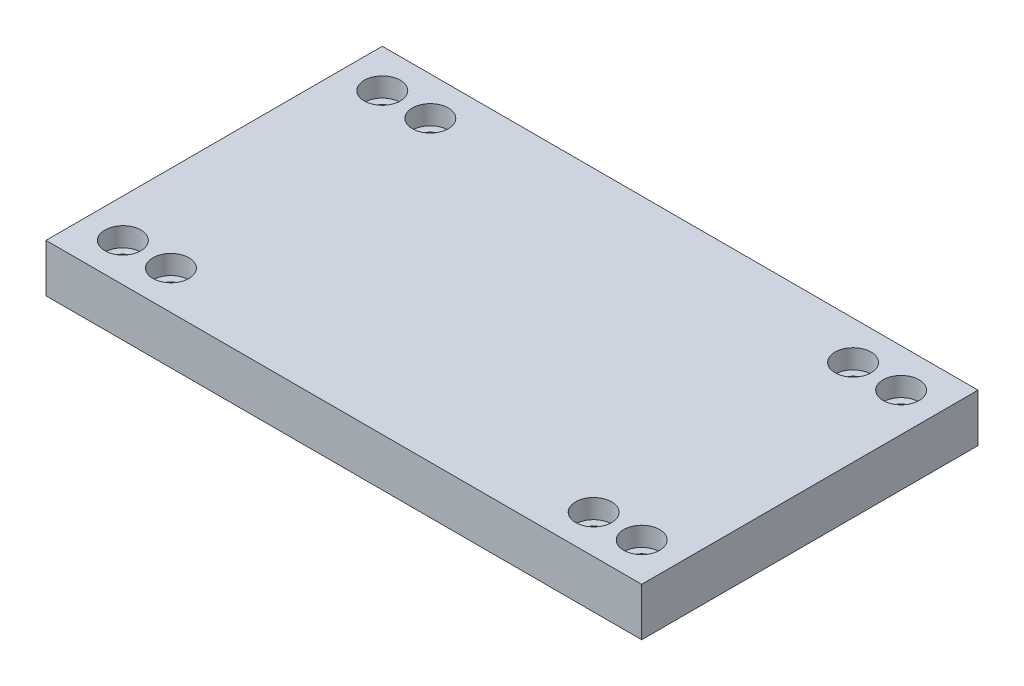
ISO-10303-21;
HEADER;
FILE_DESCRIPTION(('STEP AP214'),'2;1');
FILE_NAME('part.step','',(''),(''),'','','');
FILE_SCHEMA(('AUTOMOTIVE_DESIGN { 1 0 10303 214 1 1 1 1 }'));
ENDSEC;
DATA;
#1=APPLICATION_CONTEXT('core data for automotive mechanical design processes');
#2=APPLICATION_PROTOCOL_DEFINITION('international standard','automotive_design',2000,#1);
#3=PRODUCT_CONTEXT('',#1,'mechanical');
#4=PRODUCT('Part','Part','',(#3));
#5=PRODUCT_RELATED_PRODUCT_CATEGORY('part','',(#4));
#6=PRODUCT_DEFINITION_FORMATION('','',#4);
#7=PRODUCT_DEFINITION_CONTEXT('part definition',#1,'design');
#8=PRODUCT_DEFINITION('design','',#6,#7);
#9=PRODUCT_DEFINITION_SHAPE('','',#8);
#10=(LENGTH_UNIT() NAMED_UNIT(*) SI_UNIT(.MILLI.,.METRE.));
#11=(NAMED_UNIT(*) PLANE_ANGLE_UNIT() SI_UNIT($,.RADIAN.));
#12=(NAMED_UNIT(*) SI_UNIT($,.STERADIAN.) SOLID_ANGLE_UNIT());
#13=UNCERTAINTY_MEASURE_WITH_UNIT(LENGTH_MEASURE(1.E-05),#10,'distance_accuracy_value','');
#14=(GEOMETRIC_REPRESENTATION_CONTEXT(3) GLOBAL_UNCERTAINTY_ASSIGNED_CONTEXT((#13)) GLOBAL_UNIT_ASSIGNED_CONTEXT((#10,
#11,#12)) REPRESENTATION_CONTEXT('',''));
#15=CARTESIAN_POINT('',(0.,0.,0.));
#16=DIRECTION('',(0.,0.,1.));
#17=DIRECTION('',(1.,0.,0.));
#18=AXIS2_PLACEMENT_3D('',#15,#16,#17);
#19=CARTESIAN_POINT('',(-50.7368421052632,0.,-18.7327935222672));
#20=DIRECTION('',(0.,1.,0.));
#21=DIRECTION('',(0.,0.,1.));
#22=AXIS2_PLACEMENT_3D('',#19,#20,#21);
#23=CYLINDRICAL_SURFACE('',#22,2.15);
#24=CARTESIAN_POINT('',(-50.7368421052632,0.,-18.7327935222672));
#25=DIRECTION('',(0.,1.,0.));
#26=DIRECTION('',(0.,0.,1.));
#27=AXIS2_PLACEMENT_3D('',#24,#25,#26);
#28=CIRCLE('',#27,2.15);
#29=CARTESIAN_POINT('',(-50.7368421052632,0.,-16.5827935222672));
#30=VERTEX_POINT('',#29);
#31=EDGE_CURVE('E118',#30,#30,#28,.T.);
#32=ORIENTED_EDGE('',*,*,#31,.F.);
#33=EDGE_LOOP('',(#32));
#34=FACE_BOUND('',#33,.T.);
#35=CARTESIAN_POINT('',(-50.7368421052632,6.,-18.7327935222672));
#36=DIRECTION('',(0.,1.,0.));
#37=DIRECTION('',(0.,0.,1.));
#38=AXIS2_PLACEMENT_3D('',#35,#36,#37);
#39=CIRCLE('',#38,2.15);
#40=CARTESIAN_POINT('',(-50.7368421052632,6.,-16.5827935222672));
#41=VERTEX_POINT('',#40);
#42=EDGE_CURVE('E47',#41,#41,#39,.F.);
#43=ORIENTED_EDGE('',*,*,#42,.F.);
#44=EDGE_LOOP('',(#43));
#45=FACE_BOUND('',#44,.T.);
#46=ADVANCED_FACE('F43',(#34,#45),#23,.F.);
#47=CARTESIAN_POINT('',(57.2631578947368,0.,-18.7327935222672));
#48=DIRECTION('',(0.,1.,0.));
#49=DIRECTION('',(0.,0.,1.));
#50=AXIS2_PLACEMENT_3D('',#47,#48,#49);
#51=CYLINDRICAL_SURFACE('',#50,2.15);
#52=CARTESIAN_POINT('',(57.2631578947368,0.,-18.7327935222672));
#53=DIRECTION('',(0.,1.,0.));
#54=DIRECTION('',(0.,0.,1.));
#55=AXIS2_PLACEMENT_3D('',#52,#53,#54);
#56=CIRCLE('',#55,2.15);
#57=CARTESIAN_POINT('',(57.2631578947368,0.,-16.5827935222672));
#58=VERTEX_POINT('',#57);
#59=EDGE_CURVE('E174',#58,#58,#56,.T.);
#60=ORIENTED_EDGE('',*,*,#59,.F.);
#61=EDGE_LOOP('',(#60));
#62=FACE_BOUND('',#61,.T.);
#63=CARTESIAN_POINT('',(57.2631578947368,6.,-18.7327935222672));
#64=DIRECTION('',(0.,1.,0.));
#65=DIRECTION('',(0.,0.,1.));
#66=AXIS2_PLACEMENT_3D('',#63,#64,#65);
#67=CIRCLE('',#66,2.15);
#68=CARTESIAN_POINT('',(57.2631578947368,6.,-16.5827935222672));
#69=VERTEX_POINT('',#68);
#70=EDGE_CURVE('E156',#69,#69,#67,.F.);
#71=ORIENTED_EDGE('',*,*,#70,.F.);
#72=EDGE_LOOP('',(#71));
#73=FACE_BOUND('',#72,.T.);
#74=ADVANCED_FACE('F209',(#62,#73),#51,.F.);
#75=CARTESIAN_POINT('',(47.2631578947368,0.,35.2672064777328));
#76=DIRECTION('',(0.,1.,0.));
#77=DIRECTION('',(0.,0.,1.));
#78=AXIS2_PLACEMENT_3D('',#75,#76,#77);
#79=CYLINDRICAL_SURFACE('',#78,2.15);
#80=CARTESIAN_POINT('',(47.2631578947368,0.,35.2672064777328));
#81=DIRECTION('',(0.,1.,0.));
#82=DIRECTION('',(0.,0.,1.));
#83=AXIS2_PLACEMENT_3D('',#80,#81,#82);
#84=CIRCLE('',#83,2.15);
#85=CARTESIAN_POINT('',(47.2631578947368,0.,37.4172064777328));
#86=VERTEX_POINT('',#85);
#87=EDGE_CURVE('E168',#86,#86,#84,.T.);
#88=ORIENTED_EDGE('',*,*,#87,.F.);
#89=EDGE_LOOP('',(#88));
#90=FACE_BOUND('',#89,.T.);
#91=CARTESIAN_POINT('',(47.2631578947368,6.,35.2672064777328));
#92=DIRECTION('',(0.,1.,0.));
#93=DIRECTION('',(0.,0.,1.));
#94=AXIS2_PLACEMENT_3D('',#91,#92,#93);
#95=CIRCLE('',#94,2.15);
#96=CARTESIAN_POINT('',(47.2631578947368,6.,37.4172064777328));
#97=VERTEX_POINT('',#96);
#98=EDGE_CURVE('E153',#97,#97,#95,.F.);
#99=ORIENTED_EDGE('',*,*,#98,.F.);
#100=EDGE_LOOP('',(#99));
#101=FACE_BOUND('',#100,.T.);
#102=ADVANCED_FACE('F214',(#90,#101),#79,.F.);
#103=CARTESIAN_POINT('',(57.2631578947368,0.,35.2672064777328));
#104=DIRECTION('',(0.,1.,0.));
#105=DIRECTION('',(0.,0.,1.));
#106=AXIS2_PLACEMENT_3D('',#103,#104,#105);
#107=CYLINDRICAL_SURFACE('',#106,2.15);
#108=CARTESIAN_POINT('',(57.2631578947368,0.,35.2672064777328));
#109=DIRECTION('',(0.,1.,0.));
#110=DIRECTION('',(0.,0.,1.));
#111=AXIS2_PLACEMENT_3D('',#108,#109,#110);
#112=CIRCLE('',#111,2.15);
#113=CARTESIAN_POINT('',(57.2631578947368,0.,37.4172064777328));
#114=VERTEX_POINT('',#113);
#115=EDGE_CURVE('E163',#114,#114,#112,.T.);
#116=ORIENTED_EDGE('',*,*,#115,.F.);
#117=EDGE_LOOP('',(#116));
#118=FACE_BOUND('',#117,.T.);
#119=CARTESIAN_POINT('',(57.2631578947368,6.,35.2672064777328));
#120=DIRECTION('',(0.,1.,0.));
#121=DIRECTION('',(0.,0.,1.));
#122=AXIS2_PLACEMENT_3D('',#119,#120,#121);
#123=CIRCLE('',#122,2.15);
#124=CARTESIAN_POINT('',(57.2631578947368,6.,37.4172064777328));
#125=VERTEX_POINT('',#124);
#126=EDGE_CURVE('E149',#125,#125,#123,.F.);
#127=ORIENTED_EDGE('',*,*,#126,.F.);
#128=EDGE_LOOP('',(#127));
#129=FACE_BOUND('',#128,.T.);
#130=ADVANCED_FACE('F253',(#118,#129),#107,.F.);
#131=CARTESIAN_POINT('',(-40.7368421052632,0.,-18.7327935222672));
#132=DIRECTION('',(0.,1.,0.));
#133=DIRECTION('',(0.,0.,1.));
#134=AXIS2_PLACEMENT_3D('',#131,#132,#133);
#135=CYLINDRICAL_SURFACE('',#134,2.15);
#136=CARTESIAN_POINT('',(-40.7368421052632,0.,-18.7327935222672));
#137=DIRECTION('',(0.,1.,0.));
#138=DIRECTION('',(0.,0.,1.));
#139=AXIS2_PLACEMENT_3D('',#136,#137,#138);
#140=CIRCLE('',#139,2.15);
#141=CARTESIAN_POINT('',(-40.7368421052632,0.,-16.5827935222672));
#142=VERTEX_POINT('',#141);
#143=EDGE_CURVE('E192',#142,#142,#140,.T.);
#144=ORIENTED_EDGE('',*,*,#143,.F.);
#145=EDGE_LOOP('',(#144));
#146=FACE_BOUND('',#145,.T.);
#147=CARTESIAN_POINT('',(-40.7368421052632,6.,-18.7327935222672));
#148=DIRECTION('',(0.,1.,0.));
#149=DIRECTION('',(0.,0.,1.));
#150=AXIS2_PLACEMENT_3D('',#147,#148,#149);
#151=CIRCLE('',#150,2.15);
#152=CARTESIAN_POINT('',(-40.7368421052632,6.,-16.5827935222672));
#153=VERTEX_POINT('',#152);
#154=EDGE_CURVE('E145',#153,#153,#151,.F.);
#155=ORIENTED_EDGE('',*,*,#154,.F.);
#156=EDGE_LOOP('',(#155));
#157=FACE_BOUND('',#156,.T.);
#158=ADVANCED_FACE('F251',(#146,#157),#135,.F.);
#159=CARTESIAN_POINT('',(-50.7368421052632,0.,35.2672064777328));
#160=DIRECTION('',(0.,1.,0.));
#161=DIRECTION('',(0.,0.,1.));
#162=AXIS2_PLACEMENT_3D('',#159,#160,#161);
#163=CYLINDRICAL_SURFACE('',#162,2.15);
#164=CARTESIAN_POINT('',(-50.7368421052632,0.,35.2672064777328));
#165=DIRECTION('',(0.,1.,0.));
#166=DIRECTION('',(0.,0.,1.));
#167=AXIS2_PLACEMENT_3D('',#164,#165,#166);
#168=CIRCLE('',#167,2.15);
#169=CARTESIAN_POINT('',(-50.7368421052632,0.,37.4172064777328));
#170=VERTEX_POINT('',#169);
#171=EDGE_CURVE('E188',#170,#170,#168,.T.);
#172=ORIENTED_EDGE('',*,*,#171,.F.);
#173=EDGE_LOOP('',(#172));
#174=FACE_BOUND('',#173,.T.);
#175=CARTESIAN_POINT('',(-50.7368421052632,6.,35.2672064777328));
#176=DIRECTION('',(0.,1.,0.));
#177=DIRECTION('',(0.,0.,1.));
#178=AXIS2_PLACEMENT_3D('',#175,#176,#177);
#179=CIRCLE('',#178,2.15);
#180=CARTESIAN_POINT('',(-50.7368421052632,6.,37.4172064777328));
#181=VERTEX_POINT('',#180);
#182=EDGE_CURVE('E141',#181,#181,#179,.F.);
#183=ORIENTED_EDGE('',*,*,#182,.F.);
#184=EDGE_LOOP('',(#183));
#185=FACE_BOUND('',#184,.T.);
#186=ADVANCED_FACE('F219',(#174,#185),#163,.F.);
#187=CARTESIAN_POINT('',(-40.7368421052632,0.,35.2672064777328));
#188=DIRECTION('',(0.,1.,0.));
#189=DIRECTION('',(0.,0.,1.));
#190=AXIS2_PLACEMENT_3D('',#187,#188,#189);
#191=CYLINDRICAL_SURFACE('',#190,2.15);
#192=CARTESIAN_POINT('',(-40.7368421052632,0.,35.2672064777328));
#193=DIRECTION('',(0.,1.,0.));
#194=DIRECTION('',(0.,0.,1.));
#195=AXIS2_PLACEMENT_3D('',#192,#193,#194);
#196=CIRCLE('',#195,2.15);
#197=CARTESIAN_POINT('',(-40.7368421052632,0.,37.4172064777328));
#198=VERTEX_POINT('',#197);
#199=EDGE_CURVE('E184',#198,#198,#196,.T.);
#200=ORIENTED_EDGE('',*,*,#199,.F.);
#201=EDGE_LOOP('',(#200));
#202=FACE_BOUND('',#201,.T.);
#203=CARTESIAN_POINT('',(-40.7368421052632,6.,35.2672064777328));
#204=DIRECTION('',(0.,1.,0.));
#205=DIRECTION('',(0.,0.,1.));
#206=AXIS2_PLACEMENT_3D('',#203,#204,#205);
#207=CIRCLE('',#206,2.15);
#208=CARTESIAN_POINT('',(-40.7368421052632,6.,37.4172064777328));
#209=VERTEX_POINT('',#208);
#210=EDGE_CURVE('E136',#209,#209,#207,.F.);
#211=ORIENTED_EDGE('',*,*,#210,.F.);
#212=EDGE_LOOP('',(#211));
#213=FACE_BOUND('',#212,.T.);
#214=ADVANCED_FACE('F240',(#202,#213),#191,.F.);
#215=CARTESIAN_POINT('',(47.2631578947368,0.,-18.7327935222672));
#216=DIRECTION('',(0.,1.,0.));
#217=DIRECTION('',(0.,0.,1.));
#218=AXIS2_PLACEMENT_3D('',#215,#216,#217);
#219=CYLINDRICAL_SURFACE('',#218,2.15);
#220=CARTESIAN_POINT('',(47.2631578947368,0.,-18.7327935222672));
#221=DIRECTION('',(0.,1.,0.));
#222=DIRECTION('',(0.,0.,1.));
#223=AXIS2_PLACEMENT_3D('',#220,#221,#222);
#224=CIRCLE('',#223,2.15);
#225=CARTESIAN_POINT('',(47.2631578947368,0.,-16.5827935222672));
#226=VERTEX_POINT('',#225);
#227=EDGE_CURVE('E182',#226,#226,#224,.T.);
#228=ORIENTED_EDGE('',*,*,#227,.F.);
#229=EDGE_LOOP('',(#228));
#230=FACE_BOUND('',#229,.T.);
#231=CARTESIAN_POINT('',(47.2631578947368,6.,-18.7327935222672));
#232=DIRECTION('',(0.,1.,0.));
#233=DIRECTION('',(0.,0.,1.));
#234=AXIS2_PLACEMENT_3D('',#231,#232,#233);
#235=CIRCLE('',#234,2.15);
#236=CARTESIAN_POINT('',(47.2631578947368,6.,-16.5827935222672));
#237=VERTEX_POINT('',#236);
#238=EDGE_CURVE('E132',#237,#237,#235,.F.);
#239=ORIENTED_EDGE('',*,*,#238,.F.);
#240=EDGE_LOOP('',(#239));
#241=FACE_BOUND('',#240,.T.);
#242=ADVANCED_FACE('F236',(#230,#241),#219,.F.);
#243=CARTESIAN_POINT('',(-58.7368421052632,10.,-26.7327935222672));
#244=DIRECTION('',(1.,0.,0.));
#245=DIRECTION('',(0.,0.,-1.));
#246=AXIS2_PLACEMENT_3D('',#243,#244,#245);
#247=PLANE('',#246);
#248=DIRECTION('',(0.,0.,1.));
#249=VECTOR('',#248,1.);
#250=CARTESIAN_POINT('',(-58.7368421052632,0.,-26.7327935222672));
#251=LINE('',#250,#249);
#252=CARTESIAN_POINT('',(-58.7368421052632,0.,-26.7327935222672));
#253=VERTEX_POINT('',#252);
#254=CARTESIAN_POINT('',(-58.7368421052631,0.,43.2672064777328));
#255=VERTEX_POINT('',#254);
#256=EDGE_CURVE('E115',#253,#255,#251,.T.);
#257=ORIENTED_EDGE('',*,*,#256,.T.);
#258=DIRECTION('',(0.,-1.,0.));
#259=VECTOR('',#258,1.);
#260=CARTESIAN_POINT('',(-58.7368421052631,10.,43.2672064777328));
#261=LINE('',#260,#259);
#262=CARTESIAN_POINT('',(-58.7368421052631,10.,43.2672064777328));
#263=VERTEX_POINT('',#262);
#264=EDGE_CURVE('E11',#263,#255,#261,.T.);
#265=ORIENTED_EDGE('',*,*,#264,.F.);
#266=DIRECTION('',(0.,0.,1.));
#267=VECTOR('',#266,1.);
#268=CARTESIAN_POINT('',(-58.7368421052632,10.,-26.7327935222672));
#269=LINE('',#268,#267);
#270=CARTESIAN_POINT('',(-58.7368421052632,10.,-26.7327935222672));
#271=VERTEX_POINT('',#270);
#272=EDGE_CURVE('E96',#271,#263,#269,.T.);
#273=ORIENTED_EDGE('',*,*,#272,.F.);
#274=DIRECTION('',(0.,-1.,0.));
#275=VECTOR('',#274,1.);
#276=CARTESIAN_POINT('',(-58.7368421052632,10.,-26.7327935222672));
#277=LINE('',#276,#275);
#278=EDGE_CURVE('E63',#271,#253,#277,.T.);
#279=ORIENTED_EDGE('',*,*,#278,.T.);
#280=EDGE_LOOP('',(#257,#265,#273,#279));
#281=FACE_BOUND('',#280,.T.);
#282=ADVANCED_FACE('F45',(#281),#247,.F.);
#283=CARTESIAN_POINT('',(-58.7368421052631,10.,43.2672064777328));
#284=DIRECTION('',(0.,0.,-1.));
#285=DIRECTION('',(-1.,0.,0.));
#286=AXIS2_PLACEMENT_3D('',#283,#284,#285);
#287=PLANE('',#286);
#288=DIRECTION('',(1.,0.,0.));
#289=VECTOR('',#288,1.);
#290=CARTESIAN_POINT('',(-58.7368421052631,0.,43.2672064777328));
#291=LINE('',#290,#289);
#292=CARTESIAN_POINT('',(65.2631578947368,0.,43.2672064777328));
#293=VERTEX_POINT('',#292);
#294=EDGE_CURVE('E102',#255,#293,#291,.T.);
#295=ORIENTED_EDGE('',*,*,#294,.T.);
#296=DIRECTION('',(0.,-1.,0.));
#297=VECTOR('',#296,1.);
#298=CARTESIAN_POINT('',(65.2631578947368,10.,43.2672064777328));
#299=LINE('',#298,#297);
#300=CARTESIAN_POINT('',(65.2631578947368,10.,43.2672064777328));
#301=VERTEX_POINT('',#300);
#302=EDGE_CURVE('E54',#301,#293,#299,.T.);
#303=ORIENTED_EDGE('',*,*,#302,.F.);
#304=DIRECTION('',(1.,0.,0.));
#305=VECTOR('',#304,1.);
#306=CARTESIAN_POINT('',(-58.7368421052631,10.,43.2672064777328));
#307=LINE('',#306,#305);
#308=EDGE_CURVE('E88',#263,#301,#307,.T.);
#309=ORIENTED_EDGE('',*,*,#308,.F.);
#310=ORIENTED_EDGE('',*,*,#264,.T.);
#311=EDGE_LOOP('',(#295,#303,#309,#310));
#312=FACE_BOUND('',#311,.T.);
#313=ADVANCED_FACE('F101',(#312),#287,.F.);
#314=CARTESIAN_POINT('',(65.2631578947368,10.,-26.7327935222672));
#315=DIRECTION('',(1.,0.,0.));
#316=DIRECTION('',(0.,0.,-1.));
#317=AXIS2_PLACEMENT_3D('',#314,#315,#316);
#318=PLANE('',#317);
#319=DIRECTION('',(0.,0.,1.));
#320=VECTOR('',#319,1.);
#321=CARTESIAN_POINT('',(65.2631578947368,0.,-26.7327935222672));
#322=LINE('',#321,#320);
#323=CARTESIAN_POINT('',(65.2631578947368,0.,-26.7327935222672));
#324=VERTEX_POINT('',#323);
#325=EDGE_CURVE('E121',#324,#293,#322,.T.);
#326=ORIENTED_EDGE('',*,*,#325,.F.);
#327=DIRECTION('',(0.,-1.,0.));
#328=VECTOR('',#327,1.);
#329=CARTESIAN_POINT('',(65.2631578947368,10.,-26.7327935222672));
#330=LINE('',#329,#328);
#331=CARTESIAN_POINT('',(65.2631578947368,10.,-26.7327935222672));
#332=VERTEX_POINT('',#331);
#333=EDGE_CURVE('E77',#332,#324,#330,.T.);
#334=ORIENTED_EDGE('',*,*,#333,.F.);
#335=DIRECTION('',(0.,0.,1.));
#336=VECTOR('',#335,1.);
#337=CARTESIAN_POINT('',(65.2631578947368,10.,-26.7327935222672));
#338=LINE('',#337,#336);
#339=EDGE_CURVE('E95',#332,#301,#338,.T.);
#340=ORIENTED_EDGE('',*,*,#339,.T.);
#341=ORIENTED_EDGE('',*,*,#302,.T.);
#342=EDGE_LOOP('',(#326,#334,#340,#341));
#343=FACE_BOUND('',#342,.T.);
#344=ADVANCED_FACE('F107',(#343),#318,.T.);
#345=CARTESIAN_POINT('',(-58.7368421052632,10.,-26.7327935222672));
#346=DIRECTION('',(0.,0.,-1.));
#347=DIRECTION('',(-1.,0.,0.));
#348=AXIS2_PLACEMENT_3D('',#345,#346,#347);
#349=PLANE('',#348);
#350=DIRECTION('',(1.,0.,0.));
#351=VECTOR('',#350,1.);
#352=CARTESIAN_POINT('',(-58.7368421052632,0.,-26.7327935222672));
#353=LINE('',#352,#351);
#354=EDGE_CURVE('E124',#253,#324,#353,.T.);
#355=ORIENTED_EDGE('',*,*,#354,.F.);
#356=ORIENTED_EDGE('',*,*,#278,.F.);
#357=DIRECTION('',(1.,0.,0.));
#358=VECTOR('',#357,1.);
#359=CARTESIAN_POINT('',(-58.7368421052632,10.,-26.7327935222672));
#360=LINE('',#359,#358);
#361=EDGE_CURVE('E109',#271,#332,#360,.T.);
#362=ORIENTED_EDGE('',*,*,#361,.T.);
#363=ORIENTED_EDGE('',*,*,#333,.T.);
#364=EDGE_LOOP('',(#355,#356,#362,#363));
#365=FACE_BOUND('',#364,.T.);
#366=ADVANCED_FACE('F223',(#365),#349,.T.);
#367=CARTESIAN_POINT('',(0.,10.,0.));
#368=DIRECTION('',(0.,1.,0.));
#369=DIRECTION('',(0.,0.,1.));
#370=AXIS2_PLACEMENT_3D('',#367,#368,#369);
#371=PLANE('',#370);
#372=CARTESIAN_POINT('',(-40.7368421052632,10.,-18.7327935222672));
#373=DIRECTION('',(0.,1.,0.));
#374=DIRECTION('',(0.,0.,1.));
#375=AXIS2_PLACEMENT_3D('',#372,#373,#374);
#376=CIRCLE('',#375,3.75000000000001);
#377=CARTESIAN_POINT('',(-40.7368421052632,10.,-14.9827935222672));
#378=VERTEX_POINT('',#377);
#379=EDGE_CURVE('E360',#378,#378,#376,.T.);
#380=ORIENTED_EDGE('',*,*,#379,.F.);
#381=EDGE_LOOP('',(#380));
#382=FACE_BOUND('',#381,.T.);
#383=CARTESIAN_POINT('',(47.2631578947368,10.,-18.7327935222672));
#384=DIRECTION('',(0.,1.,0.));
#385=DIRECTION('',(0.,0.,1.));
#386=AXIS2_PLACEMENT_3D('',#383,#384,#385);
#387=CIRCLE('',#386,3.75000000000001);
#388=CARTESIAN_POINT('',(47.2631578947368,10.,-14.9827935222672));
#389=VERTEX_POINT('',#388);
#390=EDGE_CURVE('E367',#389,#389,#387,.T.);
#391=ORIENTED_EDGE('',*,*,#390,.F.);
#392=EDGE_LOOP('',(#391));
#393=FACE_BOUND('',#392,.T.);
#394=CARTESIAN_POINT('',(57.2631578947368,10.,-18.7327935222672));
#395=DIRECTION('',(0.,1.,0.));
#396=DIRECTION('',(0.,0.,1.));
#397=AXIS2_PLACEMENT_3D('',#394,#395,#396);
#398=CIRCLE('',#397,3.75);
#399=CARTESIAN_POINT('',(57.2631578947368,10.,-14.9827935222672));
#400=VERTEX_POINT('',#399);
#401=EDGE_CURVE('E375',#400,#400,#398,.T.);
#402=ORIENTED_EDGE('',*,*,#401,.F.);
#403=EDGE_LOOP('',(#402));
#404=FACE_BOUND('',#403,.T.);
#405=CARTESIAN_POINT('',(57.2631578947368,10.,35.2672064777328));
#406=DIRECTION('',(0.,1.,0.));
#407=DIRECTION('',(0.,0.,1.));
#408=AXIS2_PLACEMENT_3D('',#405,#406,#407);
#409=CIRCLE('',#408,3.75000000000001);
#410=CARTESIAN_POINT('',(57.2631578947368,10.,39.0172064777328));
#411=VERTEX_POINT('',#410);
#412=EDGE_CURVE('E383',#411,#411,#409,.T.);
#413=ORIENTED_EDGE('',*,*,#412,.F.);
#414=EDGE_LOOP('',(#413));
#415=FACE_BOUND('',#414,.T.);
#416=CARTESIAN_POINT('',(47.2631578947368,10.,35.2672064777328));
#417=DIRECTION('',(0.,1.,0.));
#418=DIRECTION('',(0.,0.,1.));
#419=AXIS2_PLACEMENT_3D('',#416,#417,#418);
#420=CIRCLE('',#419,3.75);
#421=CARTESIAN_POINT('',(47.2631578947368,10.,39.0172064777328));
#422=VERTEX_POINT('',#421);
#423=EDGE_CURVE('E390',#422,#422,#420,.T.);
#424=ORIENTED_EDGE('',*,*,#423,.F.);
#425=EDGE_LOOP('',(#424));
#426=FACE_BOUND('',#425,.T.);
#427=CARTESIAN_POINT('',(-40.7368421052632,10.,35.2672064777328));
#428=DIRECTION('',(0.,1.,0.));
#429=DIRECTION('',(0.,0.,1.));
#430=AXIS2_PLACEMENT_3D('',#427,#428,#429);
#431=CIRCLE('',#430,3.75000000000001);
#432=CARTESIAN_POINT('',(-40.7368421052632,10.,39.0172064777328));
#433=VERTEX_POINT('',#432);
#434=EDGE_CURVE('E405',#433,#433,#431,.T.);
#435=ORIENTED_EDGE('',*,*,#434,.F.);
#436=EDGE_LOOP('',(#435));
#437=FACE_BOUND('',#436,.T.);
#438=CARTESIAN_POINT('',(-50.7368421052632,10.,35.2672064777328));
#439=DIRECTION('',(0.,1.,0.));
#440=DIRECTION('',(0.,0.,1.));
#441=AXIS2_PLACEMENT_3D('',#438,#439,#440);
#442=CIRCLE('',#441,3.75);
#443=CARTESIAN_POINT('',(-50.7368421052632,10.,39.0172064777328));
#444=VERTEX_POINT('',#443);
#445=EDGE_CURVE('E352',#444,#444,#442,.T.);
#446=ORIENTED_EDGE('',*,*,#445,.F.);
#447=EDGE_LOOP('',(#446));
#448=FACE_BOUND('',#447,.T.);
#449=CARTESIAN_POINT('',(-50.7368421052632,10.,-18.7327935222672));
#450=DIRECTION('',(0.,1.,0.));
#451=DIRECTION('',(0.,0.,1.));
#452=AXIS2_PLACEMENT_3D('',#449,#450,#451);
#453=CIRCLE('',#452,3.75);
#454=CARTESIAN_POINT('',(-50.7368421052632,10.,-14.9827935222672));
#455=VERTEX_POINT('',#454);
#456=EDGE_CURVE('E178',#455,#455,#453,.T.);
#457=ORIENTED_EDGE('',*,*,#456,.F.);
#458=EDGE_LOOP('',(#457));
#459=FACE_BOUND('',#458,.T.);
#460=ORIENTED_EDGE('',*,*,#272,.T.);
#461=ORIENTED_EDGE('',*,*,#308,.T.);
#462=ORIENTED_EDGE('',*,*,#339,.F.);
#463=ORIENTED_EDGE('',*,*,#361,.F.);
#464=EDGE_LOOP('',(#460,#461,#462,#463));
#465=FACE_BOUND('',#464,.T.);
#466=ADVANCED_FACE('F92',(#382,#393,#404,#415,#426,#437,#448,#459,#465),#371,.T.);
#467=CARTESIAN_POINT('',(0.,0.,0.));
#468=DIRECTION('',(0.,1.,0.));
#469=DIRECTION('',(0.,0.,1.));
#470=AXIS2_PLACEMENT_3D('',#467,#468,#469);
#471=PLANE('',#470);
#472=ORIENTED_EDGE('',*,*,#227,.T.);
#473=EDGE_LOOP('',(#472));
#474=FACE_BOUND('',#473,.T.);
#475=ORIENTED_EDGE('',*,*,#199,.T.);
#476=EDGE_LOOP('',(#475));
#477=FACE_BOUND('',#476,.T.);
#478=ORIENTED_EDGE('',*,*,#171,.T.);
#479=EDGE_LOOP('',(#478));
#480=FACE_BOUND('',#479,.T.);
#481=ORIENTED_EDGE('',*,*,#143,.T.);
#482=EDGE_LOOP('',(#481));
#483=FACE_BOUND('',#482,.T.);
#484=ORIENTED_EDGE('',*,*,#115,.T.);
#485=EDGE_LOOP('',(#484));
#486=FACE_BOUND('',#485,.T.);
#487=ORIENTED_EDGE('',*,*,#87,.T.);
#488=EDGE_LOOP('',(#487));
#489=FACE_BOUND('',#488,.T.);
#490=ORIENTED_EDGE('',*,*,#59,.T.);
#491=EDGE_LOOP('',(#490));
#492=FACE_BOUND('',#491,.T.);
#493=ORIENTED_EDGE('',*,*,#31,.T.);
#494=EDGE_LOOP('',(#493));
#495=FACE_BOUND('',#494,.T.);
#496=ORIENTED_EDGE('',*,*,#256,.F.);
#497=ORIENTED_EDGE('',*,*,#354,.T.);
#498=ORIENTED_EDGE('',*,*,#325,.T.);
#499=ORIENTED_EDGE('',*,*,#294,.F.);
#500=EDGE_LOOP('',(#496,#497,#498,#499));
#501=FACE_BOUND('',#500,.T.);
#502=ADVANCED_FACE('F204',(#474,#477,#480,#483,#486,#489,#492,#495,#501),#471,.F.);
#503=CARTESIAN_POINT('',(47.2631578947368,6.,-18.7327935222672));
#504=DIRECTION('',(0.,1.,0.));
#505=DIRECTION('',(0.,0.,1.));
#506=AXIS2_PLACEMENT_3D('',#503,#504,#505);
#507=PLANE('',#506);
#508=CARTESIAN_POINT('',(47.2631578947368,6.,-18.7327935222672));
#509=DIRECTION('',(0.,1.,0.));
#510=DIRECTION('',(0.,0.,1.));
#511=AXIS2_PLACEMENT_3D('',#508,#509,#510);
#512=CIRCLE('',#511,3.75000000000001);
#513=CARTESIAN_POINT('',(47.2631578947368,6.,-14.9827935222672));
#514=VERTEX_POINT('',#513);
#515=EDGE_CURVE('E371',#514,#514,#512,.T.);
#516=ORIENTED_EDGE('',*,*,#515,.T.);
#517=EDGE_LOOP('',(#516));
#518=FACE_BOUND('',#517,.T.);
#519=ORIENTED_EDGE('',*,*,#238,.T.);
#520=EDGE_LOOP('',(#519));
#521=FACE_BOUND('',#520,.T.);
#522=ADVANCED_FACE('F227',(#518,#521),#507,.T.);
#523=CARTESIAN_POINT('',(47.2631578947368,6.,-18.7327935222672));
#524=DIRECTION('',(0.,1.,0.));
#525=DIRECTION('',(0.,0.,1.));
#526=AXIS2_PLACEMENT_3D('',#523,#524,#525);
#527=CYLINDRICAL_SURFACE('',#526,3.75000000000001);
#528=ORIENTED_EDGE('',*,*,#515,.F.);
#529=EDGE_LOOP('',(#528));
#530=FACE_BOUND('',#529,.T.);
#531=ORIENTED_EDGE('',*,*,#390,.T.);
#532=EDGE_LOOP('',(#531));
#533=FACE_BOUND('',#532,.T.);
#534=ADVANCED_FACE('F285',(#530,#533),#527,.F.);
#535=CARTESIAN_POINT('',(-40.7368421052632,6.,35.2672064777328));
#536=DIRECTION('',(0.,1.,0.));
#537=DIRECTION('',(0.,0.,1.));
#538=AXIS2_PLACEMENT_3D('',#535,#536,#537);
#539=PLANE('',#538);
#540=CARTESIAN_POINT('',(-40.7368421052632,6.,35.2672064777328));
#541=DIRECTION('',(0.,1.,0.));
#542=DIRECTION('',(0.,0.,1.));
#543=AXIS2_PLACEMENT_3D('',#540,#541,#542);
#544=CIRCLE('',#543,3.75000000000001);
#545=CARTESIAN_POINT('',(-40.7368421052632,6.,39.0172064777328));
#546=VERTEX_POINT('',#545);
#547=EDGE_CURVE('E356',#546,#546,#544,.T.);
#548=ORIENTED_EDGE('',*,*,#547,.T.);
#549=EDGE_LOOP('',(#548));
#550=FACE_BOUND('',#549,.T.);
#551=ORIENTED_EDGE('',*,*,#210,.T.);
#552=EDGE_LOOP('',(#551));
#553=FACE_BOUND('',#552,.T.);
#554=ADVANCED_FACE('F288',(#550,#553),#539,.T.);
#555=CARTESIAN_POINT('',(-40.7368421052632,6.,35.2672064777328));
#556=DIRECTION('',(0.,1.,0.));
#557=DIRECTION('',(0.,0.,1.));
#558=AXIS2_PLACEMENT_3D('',#555,#556,#557);
#559=CYLINDRICAL_SURFACE('',#558,3.75000000000001);
#560=ORIENTED_EDGE('',*,*,#547,.F.);
#561=EDGE_LOOP('',(#560));
#562=FACE_BOUND('',#561,.T.);
#563=ORIENTED_EDGE('',*,*,#434,.T.);
#564=EDGE_LOOP('',(#563));
#565=FACE_BOUND('',#564,.T.);
#566=ADVANCED_FACE('F335',(#562,#565),#559,.F.);
#567=CARTESIAN_POINT('',(-50.7368421052632,6.,35.2672064777328));
#568=DIRECTION('',(0.,1.,0.));
#569=DIRECTION('',(0.,0.,1.));
#570=AXIS2_PLACEMENT_3D('',#567,#568,#569);
#571=PLANE('',#570);
#572=CARTESIAN_POINT('',(-50.7368421052632,6.,35.2672064777328));
#573=DIRECTION('',(0.,1.,0.));
#574=DIRECTION('',(0.,0.,1.));
#575=AXIS2_PLACEMENT_3D('',#572,#573,#574);
#576=CIRCLE('',#575,3.75);
#577=CARTESIAN_POINT('',(-50.7368421052632,6.,39.0172064777328));
#578=VERTEX_POINT('',#577);
#579=EDGE_CURVE('E348',#578,#578,#576,.T.);
#580=ORIENTED_EDGE('',*,*,#579,.T.);
#581=EDGE_LOOP('',(#580));
#582=FACE_BOUND('',#581,.T.);
#583=ORIENTED_EDGE('',*,*,#182,.T.);
#584=EDGE_LOOP('',(#583));
#585=FACE_BOUND('',#584,.T.);
#586=ADVANCED_FACE('F279',(#582,#585),#571,.T.);
#587=CARTESIAN_POINT('',(-50.7368421052632,6.,35.2672064777328));
#588=DIRECTION('',(0.,1.,0.));
#589=DIRECTION('',(0.,0.,1.));
#590=AXIS2_PLACEMENT_3D('',#587,#588,#589);
#591=CYLINDRICAL_SURFACE('',#590,3.75);
#592=ORIENTED_EDGE('',*,*,#579,.F.);
#593=EDGE_LOOP('',(#592));
#594=FACE_BOUND('',#593,.T.);
#595=ORIENTED_EDGE('',*,*,#445,.T.);
#596=EDGE_LOOP('',(#595));
#597=FACE_BOUND('',#596,.T.);
#598=ADVANCED_FACE('F269',(#594,#597),#591,.F.);
#599=CARTESIAN_POINT('',(-40.7368421052632,6.,-18.7327935222672));
#600=DIRECTION('',(0.,1.,0.));
#601=DIRECTION('',(0.,0.,1.));
#602=AXIS2_PLACEMENT_3D('',#599,#600,#601);
#603=PLANE('',#602);
#604=CARTESIAN_POINT('',(-40.7368421052632,6.,-18.7327935222672));
#605=DIRECTION('',(0.,1.,0.));
#606=DIRECTION('',(0.,0.,1.));
#607=AXIS2_PLACEMENT_3D('',#604,#605,#606);
#608=CIRCLE('',#607,3.75000000000001);
#609=CARTESIAN_POINT('',(-40.7368421052632,6.,-14.9827935222672));
#610=VERTEX_POINT('',#609);
#611=EDGE_CURVE('E364',#610,#610,#608,.T.);
#612=ORIENTED_EDGE('',*,*,#611,.T.);
#613=EDGE_LOOP('',(#612));
#614=FACE_BOUND('',#613,.T.);
#615=ORIENTED_EDGE('',*,*,#154,.T.);
#616=EDGE_LOOP('',(#615));
#617=FACE_BOUND('',#616,.T.);
#618=ADVANCED_FACE('F266',(#614,#617),#603,.T.);
#619=CARTESIAN_POINT('',(-40.7368421052632,6.,-18.7327935222672));
#620=DIRECTION('',(0.,1.,0.));
#621=DIRECTION('',(0.,0.,1.));
#622=AXIS2_PLACEMENT_3D('',#619,#620,#621);
#623=CYLINDRICAL_SURFACE('',#622,3.75000000000001);
#624=ORIENTED_EDGE('',*,*,#611,.F.);
#625=EDGE_LOOP('',(#624));
#626=FACE_BOUND('',#625,.T.);
#627=ORIENTED_EDGE('',*,*,#379,.T.);
#628=EDGE_LOOP('',(#627));
#629=FACE_BOUND('',#628,.T.);
#630=ADVANCED_FACE('F268',(#626,#629),#623,.F.);
#631=CARTESIAN_POINT('',(57.2631578947368,6.,35.2672064777328));
#632=DIRECTION('',(0.,1.,0.));
#633=DIRECTION('',(0.,0.,1.));
#634=AXIS2_PLACEMENT_3D('',#631,#632,#633);
#635=PLANE('',#634);
#636=CARTESIAN_POINT('',(57.2631578947368,6.,35.2672064777328));
#637=DIRECTION('',(0.,1.,0.));
#638=DIRECTION('',(0.,0.,1.));
#639=AXIS2_PLACEMENT_3D('',#636,#637,#638);
#640=CIRCLE('',#639,3.75000000000001);
#641=CARTESIAN_POINT('',(57.2631578947368,6.,39.0172064777328));
#642=VERTEX_POINT('',#641);
#643=EDGE_CURVE('E387',#642,#642,#640,.T.);
#644=ORIENTED_EDGE('',*,*,#643,.T.);
#645=EDGE_LOOP('',(#644));
#646=FACE_BOUND('',#645,.T.);
#647=ORIENTED_EDGE('',*,*,#126,.T.);
#648=EDGE_LOOP('',(#647));
#649=FACE_BOUND('',#648,.T.);
#650=ADVANCED_FACE('F276',(#646,#649),#635,.T.);
#651=CARTESIAN_POINT('',(57.2631578947368,6.,35.2672064777328));
#652=DIRECTION('',(0.,1.,0.));
#653=DIRECTION('',(0.,0.,1.));
#654=AXIS2_PLACEMENT_3D('',#651,#652,#653);
#655=CYLINDRICAL_SURFACE('',#654,3.75000000000001);
#656=ORIENTED_EDGE('',*,*,#643,.F.);
#657=EDGE_LOOP('',(#656));
#658=FACE_BOUND('',#657,.T.);
#659=ORIENTED_EDGE('',*,*,#412,.T.);
#660=EDGE_LOOP('',(#659));
#661=FACE_BOUND('',#660,.T.);
#662=ADVANCED_FACE('F303',(#658,#661),#655,.F.);
#663=CARTESIAN_POINT('',(47.2631578947368,6.,35.2672064777328));
#664=DIRECTION('',(0.,1.,0.));
#665=DIRECTION('',(0.,0.,1.));
#666=AXIS2_PLACEMENT_3D('',#663,#664,#665);
#667=PLANE('',#666);
#668=CARTESIAN_POINT('',(47.2631578947368,6.,35.2672064777328));
#669=DIRECTION('',(0.,1.,0.));
#670=DIRECTION('',(0.,0.,1.));
#671=AXIS2_PLACEMENT_3D('',#668,#669,#670);
#672=CIRCLE('',#671,3.75);
#673=CARTESIAN_POINT('',(47.2631578947368,6.,39.0172064777328));
#674=VERTEX_POINT('',#673);
#675=EDGE_CURVE('E402',#674,#674,#672,.T.);
#676=ORIENTED_EDGE('',*,*,#675,.T.);
#677=EDGE_LOOP('',(#676));
#678=FACE_BOUND('',#677,.T.);
#679=ORIENTED_EDGE('',*,*,#98,.T.);
#680=EDGE_LOOP('',(#679));
#681=FACE_BOUND('',#680,.T.);
#682=ADVANCED_FACE('F306',(#678,#681),#667,.T.);
#683=CARTESIAN_POINT('',(47.2631578947368,6.,35.2672064777328));
#684=DIRECTION('',(0.,1.,0.));
#685=DIRECTION('',(0.,0.,1.));
#686=AXIS2_PLACEMENT_3D('',#683,#684,#685);
#687=CYLINDRICAL_SURFACE('',#686,3.75);
#688=ORIENTED_EDGE('',*,*,#675,.F.);
#689=EDGE_LOOP('',(#688));
#690=FACE_BOUND('',#689,.T.);
#691=ORIENTED_EDGE('',*,*,#423,.T.);
#692=EDGE_LOOP('',(#691));
#693=FACE_BOUND('',#692,.T.);
#694=ADVANCED_FACE('F301',(#690,#693),#687,.F.);
#695=CARTESIAN_POINT('',(57.2631578947368,6.,-18.7327935222672));
#696=DIRECTION('',(0.,1.,0.));
#697=DIRECTION('',(0.,0.,1.));
#698=AXIS2_PLACEMENT_3D('',#695,#696,#697);
#699=PLANE('',#698);
#700=CARTESIAN_POINT('',(57.2631578947368,6.,-18.7327935222672));
#701=DIRECTION('',(0.,1.,0.));
#702=DIRECTION('',(0.,0.,1.));
#703=AXIS2_PLACEMENT_3D('',#700,#701,#702);
#704=CIRCLE('',#703,3.75);
#705=CARTESIAN_POINT('',(57.2631578947368,6.,-14.9827935222672));
#706=VERTEX_POINT('',#705);
#707=EDGE_CURVE('E379',#706,#706,#704,.T.);
#708=ORIENTED_EDGE('',*,*,#707,.T.);
#709=EDGE_LOOP('',(#708));
#710=FACE_BOUND('',#709,.T.);
#711=ORIENTED_EDGE('',*,*,#70,.T.);
#712=EDGE_LOOP('',(#711));
#713=FACE_BOUND('',#712,.T.);
#714=ADVANCED_FACE('F297',(#710,#713),#699,.T.);
#715=CARTESIAN_POINT('',(57.2631578947368,6.,-18.7327935222672));
#716=DIRECTION('',(0.,1.,0.));
#717=DIRECTION('',(0.,0.,1.));
#718=AXIS2_PLACEMENT_3D('',#715,#716,#717);
#719=CYLINDRICAL_SURFACE('',#718,3.75);
#720=ORIENTED_EDGE('',*,*,#707,.F.);
#721=EDGE_LOOP('',(#720));
#722=FACE_BOUND('',#721,.T.);
#723=ORIENTED_EDGE('',*,*,#401,.T.);
#724=EDGE_LOOP('',(#723));
#725=FACE_BOUND('',#724,.T.);
#726=ADVANCED_FACE('F293',(#722,#725),#719,.F.);
#727=CARTESIAN_POINT('',(-50.7368421052632,6.,-18.7327935222672));
#728=DIRECTION('',(0.,1.,0.));
#729=DIRECTION('',(0.,0.,1.));
#730=AXIS2_PLACEMENT_3D('',#727,#728,#729);
#731=PLANE('',#730);
#732=CARTESIAN_POINT('',(-50.7368421052632,6.,-18.7327935222672));
#733=DIRECTION('',(0.,1.,0.));
#734=DIRECTION('',(0.,0.,1.));
#735=AXIS2_PLACEMENT_3D('',#732,#733,#734);
#736=CIRCLE('',#735,3.75);
#737=CARTESIAN_POINT('',(-50.7368421052632,6.,-14.9827935222672));
#738=VERTEX_POINT('',#737);
#739=EDGE_CURVE('E137',#738,#738,#736,.T.);
#740=ORIENTED_EDGE('',*,*,#739,.T.);
#741=EDGE_LOOP('',(#740));
#742=FACE_BOUND('',#741,.T.);
#743=ORIENTED_EDGE('',*,*,#42,.T.);
#744=EDGE_LOOP('',(#743));
#745=FACE_BOUND('',#744,.T.);
#746=ADVANCED_FACE('F296',(#742,#745),#731,.T.);
#747=CARTESIAN_POINT('',(-50.7368421052632,6.,-18.7327935222672));
#748=DIRECTION('',(0.,1.,0.));
#749=DIRECTION('',(0.,0.,1.));
#750=AXIS2_PLACEMENT_3D('',#747,#748,#749);
#751=CYLINDRICAL_SURFACE('',#750,3.75);
#752=ORIENTED_EDGE('',*,*,#739,.F.);
#753=EDGE_LOOP('',(#752));
#754=FACE_BOUND('',#753,.T.);
#755=ORIENTED_EDGE('',*,*,#456,.T.);
#756=EDGE_LOOP('',(#755));
#757=FACE_BOUND('',#756,.T.);
#758=ADVANCED_FACE('F313',(#754,#757),#751,.F.);
#759=CLOSED_SHELL('',(#46,#74,#102,#130,#158,#186,#214,#242,#282,#313,#344,#366,#466,#502,#522,
#534,#554,#566,#586,#598,#618,#630,#650,#662,#682,#694,#714,#726,#746,#758));
#760=MANIFOLD_SOLID_BREP('B2',#759);
#761=ADVANCED_BREP_SHAPE_REPRESENTATION('',(#18,#760),#14);
#762=SHAPE_DEFINITION_REPRESENTATION(#9,#761);
ENDSEC;
END-ISO-10303-21;
